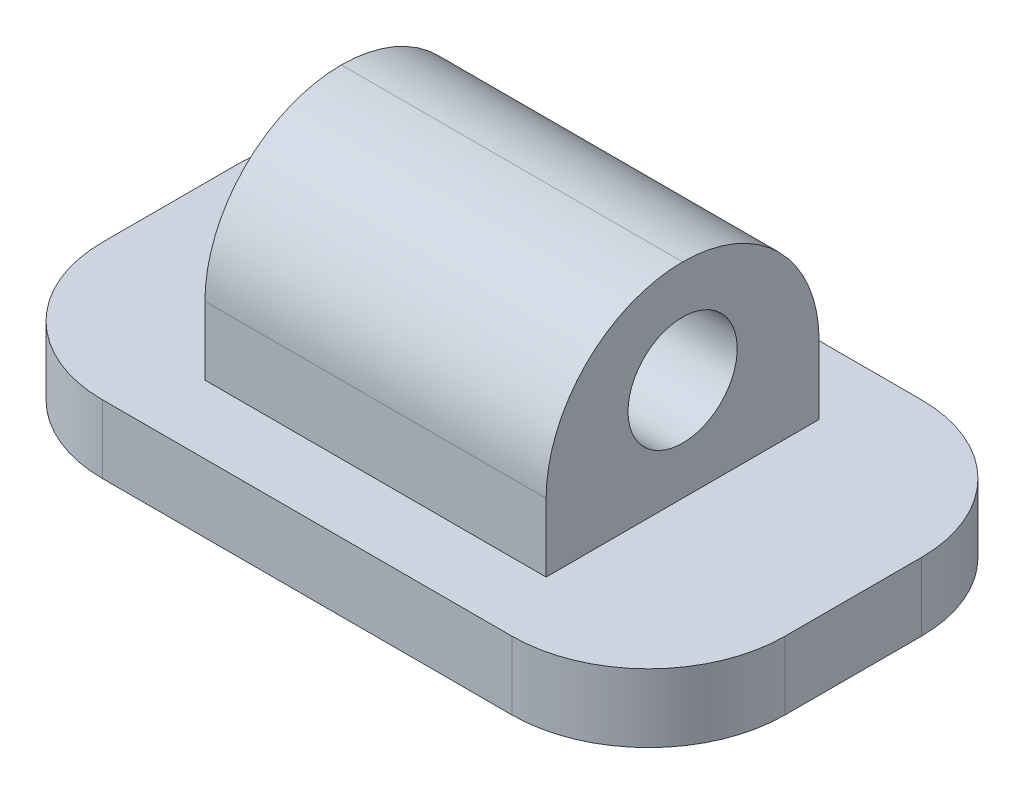
ISO-10303-21;
HEADER;
FILE_DESCRIPTION(('STEP AP214'),'2;1');
FILE_NAME('part.step','',(''),(''),'','','');
FILE_SCHEMA(('AUTOMOTIVE_DESIGN { 1 0 10303 214 1 1 1 1 }'));
ENDSEC;
DATA;
#1=APPLICATION_CONTEXT('core data for automotive mechanical design processes');
#2=APPLICATION_PROTOCOL_DEFINITION('international standard','automotive_design',2000,#1);
#3=PRODUCT_CONTEXT('',#1,'mechanical');
#4=PRODUCT('Part','Part','',(#3));
#5=PRODUCT_RELATED_PRODUCT_CATEGORY('part','',(#4));
#6=PRODUCT_DEFINITION_FORMATION('','',#4);
#7=PRODUCT_DEFINITION_CONTEXT('part definition',#1,'design');
#8=PRODUCT_DEFINITION('design','',#6,#7);
#9=PRODUCT_DEFINITION_SHAPE('','',#8);
#10=(LENGTH_UNIT() NAMED_UNIT(*) SI_UNIT(.MILLI.,.METRE.));
#11=(NAMED_UNIT(*) PLANE_ANGLE_UNIT() SI_UNIT($,.RADIAN.));
#12=(NAMED_UNIT(*) SI_UNIT($,.STERADIAN.) SOLID_ANGLE_UNIT());
#13=UNCERTAINTY_MEASURE_WITH_UNIT(LENGTH_MEASURE(1.E-05),#10,'distance_accuracy_value','');
#14=(GEOMETRIC_REPRESENTATION_CONTEXT(3) GLOBAL_UNCERTAINTY_ASSIGNED_CONTEXT((#13)) GLOBAL_UNIT_ASSIGNED_CONTEXT((#10,
#11,#12)) REPRESENTATION_CONTEXT('',''));
#15=CARTESIAN_POINT('',(0.,0.,0.));
#16=DIRECTION('',(0.,0.,1.));
#17=DIRECTION('',(1.,0.,0.));
#18=AXIS2_PLACEMENT_3D('',#15,#16,#17);
#19=CARTESIAN_POINT('',(0.,5.,0.));
#20=DIRECTION('',(0.,-1.,0.));
#21=DIRECTION('',(0.,0.,-1.));
#22=AXIS2_PLACEMENT_3D('',#19,#20,#21);
#23=PLANE('',#22);
#24=DIRECTION('',(0.,0.,-1.));
#25=VECTOR('',#24,1.);
#26=CARTESIAN_POINT('',(25.,5.,15.));
#27=LINE('',#26,#25);
#28=CARTESIAN_POINT('',(25.,5.,5.));
#29=VERTEX_POINT('',#28);
#30=CARTESIAN_POINT('',(25.,5.,-5.));
#31=VERTEX_POINT('',#30);
#32=EDGE_CURVE('E171',#29,#31,#27,.T.);
#33=ORIENTED_EDGE('',*,*,#32,.T.);
#34=CARTESIAN_POINT('',(15.,5.,-5.));
#35=DIRECTION('',(0.,-1.,0.));
#36=DIRECTION('',(0.,0.,-1.));
#37=AXIS2_PLACEMENT_3D('',#34,#35,#36);
#38=CIRCLE('',#37,10.);
#39=CARTESIAN_POINT('',(15.,5.,-15.));
#40=VERTEX_POINT('',#39);
#41=EDGE_CURVE('E237',#31,#40,#38,.F.);
#42=ORIENTED_EDGE('',*,*,#41,.T.);
#43=DIRECTION('',(-1.,0.,0.));
#44=VECTOR('',#43,1.);
#45=CARTESIAN_POINT('',(-25.,5.,-15.));
#46=LINE('',#45,#44);
#47=CARTESIAN_POINT('',(-15.,5.,-15.));
#48=VERTEX_POINT('',#47);
#49=EDGE_CURVE('E175',#40,#48,#46,.T.);
#50=ORIENTED_EDGE('',*,*,#49,.T.);
#51=CARTESIAN_POINT('',(-15.,5.,-5.));
#52=DIRECTION('',(0.,-1.,0.));
#53=DIRECTION('',(0.,0.,-1.));
#54=AXIS2_PLACEMENT_3D('',#51,#52,#53);
#55=CIRCLE('',#54,10.);
#56=CARTESIAN_POINT('',(-25.,5.,-5.));
#57=VERTEX_POINT('',#56);
#58=EDGE_CURVE('E228',#48,#57,#55,.F.);
#59=ORIENTED_EDGE('',*,*,#58,.T.);
#60=DIRECTION('',(0.,0.,1.));
#61=VECTOR('',#60,1.);
#62=CARTESIAN_POINT('',(-25.,5.,15.));
#63=LINE('',#62,#61);
#64=CARTESIAN_POINT('',(-25.,5.,5.));
#65=VERTEX_POINT('',#64);
#66=EDGE_CURVE('E180',#57,#65,#63,.T.);
#67=ORIENTED_EDGE('',*,*,#66,.T.);
#68=CARTESIAN_POINT('',(-15.,5.,5.));
#69=DIRECTION('',(0.,-1.,0.));
#70=DIRECTION('',(0.,0.,-1.));
#71=AXIS2_PLACEMENT_3D('',#68,#69,#70);
#72=CIRCLE('',#71,10.);
#73=CARTESIAN_POINT('',(-15.,5.,15.));
#74=VERTEX_POINT('',#73);
#75=EDGE_CURVE('E231',#65,#74,#72,.F.);
#76=ORIENTED_EDGE('',*,*,#75,.T.);
#77=DIRECTION('',(1.,0.,0.));
#78=VECTOR('',#77,1.);
#79=CARTESIAN_POINT('',(-25.,5.,15.));
#80=LINE('',#79,#78);
#81=CARTESIAN_POINT('',(15.,5.,15.));
#82=VERTEX_POINT('',#81);
#83=EDGE_CURVE('E184',#74,#82,#80,.T.);
#84=ORIENTED_EDGE('',*,*,#83,.T.);
#85=CARTESIAN_POINT('',(15.,5.,5.));
#86=DIRECTION('',(0.,-1.,0.));
#87=DIRECTION('',(0.,0.,-1.));
#88=AXIS2_PLACEMENT_3D('',#85,#86,#87);
#89=CIRCLE('',#88,10.);
#90=EDGE_CURVE('E234',#82,#29,#89,.F.);
#91=ORIENTED_EDGE('',*,*,#90,.T.);
#92=EDGE_LOOP('',(#33,#42,#50,#59,#67,#76,#84,#91));
#93=FACE_BOUND('',#92,.T.);
#94=DIRECTION('',(0.,0.,-1.));
#95=VECTOR('',#94,1.);
#96=CARTESIAN_POINT('',(12.5,5.,10.));
#97=LINE('',#96,#95);
#98=CARTESIAN_POINT('',(12.5,5.,10.));
#99=VERTEX_POINT('',#98);
#100=CARTESIAN_POINT('',(12.5,5.,-10.));
#101=VERTEX_POINT('',#100);
#102=EDGE_CURVE('E154',#99,#101,#97,.T.);
#103=ORIENTED_EDGE('',*,*,#102,.F.);
#104=DIRECTION('',(1.,0.,0.));
#105=VECTOR('',#104,1.);
#106=CARTESIAN_POINT('',(-12.5,5.,10.));
#107=LINE('',#106,#105);
#108=CARTESIAN_POINT('',(-12.5,5.,10.));
#109=VERTEX_POINT('',#108);
#110=EDGE_CURVE('E148',#109,#99,#107,.T.);
#111=ORIENTED_EDGE('',*,*,#110,.F.);
#112=DIRECTION('',(0.,0.,1.));
#113=VECTOR('',#112,1.);
#114=CARTESIAN_POINT('',(-12.5,5.,10.));
#115=LINE('',#114,#113);
#116=CARTESIAN_POINT('',(-12.5,5.,-10.));
#117=VERTEX_POINT('',#116);
#118=EDGE_CURVE('E133',#117,#109,#115,.T.);
#119=ORIENTED_EDGE('',*,*,#118,.F.);
#120=DIRECTION('',(-1.,0.,0.));
#121=VECTOR('',#120,1.);
#122=CARTESIAN_POINT('',(-12.5,5.,-10.));
#123=LINE('',#122,#121);
#124=EDGE_CURVE('E145',#101,#117,#123,.T.);
#125=ORIENTED_EDGE('',*,*,#124,.F.);
#126=EDGE_LOOP('',(#103,#111,#119,#125));
#127=FACE_BOUND('',#126,.T.);
#128=ADVANCED_FACE('F39',(#93,#127),#23,.F.);
#129=CARTESIAN_POINT('',(25.,5.,15.));
#130=DIRECTION('',(-1.,0.,0.));
#131=DIRECTION('',(0.,0.,1.));
#132=AXIS2_PLACEMENT_3D('',#129,#130,#131);
#133=PLANE('',#132);
#134=DIRECTION('',(0.,0.,-1.));
#135=VECTOR('',#134,1.);
#136=CARTESIAN_POINT('',(25.,0.,15.));
#137=LINE('',#136,#135);
#138=CARTESIAN_POINT('',(25.,0.,5.));
#139=VERTEX_POINT('',#138);
#140=CARTESIAN_POINT('',(25.,0.,-5.));
#141=VERTEX_POINT('',#140);
#142=EDGE_CURVE('E170',#139,#141,#137,.T.);
#143=ORIENTED_EDGE('',*,*,#142,.T.);
#144=DIRECTION('',(0.,-1.,0.));
#145=VECTOR('',#144,1.);
#146=CARTESIAN_POINT('',(25.,5.,-5.));
#147=LINE('',#146,#145);
#148=EDGE_CURVE('E225',#141,#31,#147,.F.);
#149=ORIENTED_EDGE('',*,*,#148,.T.);
#150=ORIENTED_EDGE('',*,*,#32,.F.);
#151=DIRECTION('',(0.,-1.,0.));
#152=VECTOR('',#151,1.);
#153=CARTESIAN_POINT('',(25.,5.,5.));
#154=LINE('',#153,#152);
#155=EDGE_CURVE('E221',#29,#139,#154,.T.);
#156=ORIENTED_EDGE('',*,*,#155,.T.);
#157=EDGE_LOOP('',(#143,#149,#150,#156));
#158=FACE_BOUND('',#157,.T.);
#159=ADVANCED_FACE('F301',(#158),#133,.F.);
#160=CARTESIAN_POINT('',(-25.,5.,-15.));
#161=DIRECTION('',(0.,0.,1.));
#162=DIRECTION('',(1.,0.,0.));
#163=AXIS2_PLACEMENT_3D('',#160,#161,#162);
#164=PLANE('',#163);
#165=ORIENTED_EDGE('',*,*,#49,.F.);
#166=DIRECTION('',(0.,-1.,0.));
#167=VECTOR('',#166,1.);
#168=CARTESIAN_POINT('',(15.,5.,-15.));
#169=LINE('',#168,#167);
#170=CARTESIAN_POINT('',(15.,0.,-15.));
#171=VERTEX_POINT('',#170);
#172=EDGE_CURVE('E205',#40,#171,#169,.T.);
#173=ORIENTED_EDGE('',*,*,#172,.T.);
#174=DIRECTION('',(-1.,0.,0.));
#175=VECTOR('',#174,1.);
#176=CARTESIAN_POINT('',(-25.,0.,-15.));
#177=LINE('',#176,#175);
#178=CARTESIAN_POINT('',(-15.,0.,-15.));
#179=VERTEX_POINT('',#178);
#180=EDGE_CURVE('E192',#171,#179,#177,.T.);
#181=ORIENTED_EDGE('',*,*,#180,.T.);
#182=DIRECTION('',(0.,-1.,0.));
#183=VECTOR('',#182,1.);
#184=CARTESIAN_POINT('',(-15.,5.,-15.));
#185=LINE('',#184,#183);
#186=EDGE_CURVE('E188',#179,#48,#185,.F.);
#187=ORIENTED_EDGE('',*,*,#186,.T.);
#188=EDGE_LOOP('',(#165,#173,#181,#187));
#189=FACE_BOUND('',#188,.T.);
#190=ADVANCED_FACE('F307',(#189),#164,.F.);
#191=CARTESIAN_POINT('',(-25.,5.,15.));
#192=DIRECTION('',(1.,0.,0.));
#193=DIRECTION('',(0.,0.,-1.));
#194=AXIS2_PLACEMENT_3D('',#191,#192,#193);
#195=PLANE('',#194);
#196=DIRECTION('',(0.,0.,1.));
#197=VECTOR('',#196,1.);
#198=CARTESIAN_POINT('',(-25.,0.,15.));
#199=LINE('',#198,#197);
#200=CARTESIAN_POINT('',(-25.,0.,-5.));
#201=VERTEX_POINT('',#200);
#202=CARTESIAN_POINT('',(-25.,0.,5.));
#203=VERTEX_POINT('',#202);
#204=EDGE_CURVE('E196',#201,#203,#199,.T.);
#205=ORIENTED_EDGE('',*,*,#204,.T.);
#206=DIRECTION('',(0.,-1.,0.));
#207=VECTOR('',#206,1.);
#208=CARTESIAN_POINT('',(-25.,5.,5.));
#209=LINE('',#208,#207);
#210=EDGE_CURVE('E251',#203,#65,#209,.F.);
#211=ORIENTED_EDGE('',*,*,#210,.T.);
#212=ORIENTED_EDGE('',*,*,#66,.F.);
#213=DIRECTION('',(0.,-1.,0.));
#214=VECTOR('',#213,1.);
#215=CARTESIAN_POINT('',(-25.,5.,-5.));
#216=LINE('',#215,#214);
#217=EDGE_CURVE('E247',#57,#201,#216,.T.);
#218=ORIENTED_EDGE('',*,*,#217,.T.);
#219=EDGE_LOOP('',(#205,#211,#212,#218));
#220=FACE_BOUND('',#219,.T.);
#221=ADVANCED_FACE('F321',(#220),#195,.F.);
#222=CARTESIAN_POINT('',(-25.,5.,15.));
#223=DIRECTION('',(0.,0.,-1.));
#224=DIRECTION('',(-1.,0.,0.));
#225=AXIS2_PLACEMENT_3D('',#222,#223,#224);
#226=PLANE('',#225);
#227=DIRECTION('',(1.,0.,0.));
#228=VECTOR('',#227,1.);
#229=CARTESIAN_POINT('',(-25.,0.,15.));
#230=LINE('',#229,#228);
#231=CARTESIAN_POINT('',(-15.,0.,15.));
#232=VERTEX_POINT('',#231);
#233=CARTESIAN_POINT('',(15.,0.,15.));
#234=VERTEX_POINT('',#233);
#235=EDGE_CURVE('E176',#232,#234,#230,.T.);
#236=ORIENTED_EDGE('',*,*,#235,.T.);
#237=DIRECTION('',(0.,-1.,0.));
#238=VECTOR('',#237,1.);
#239=CARTESIAN_POINT('',(15.,5.,15.));
#240=LINE('',#239,#238);
#241=EDGE_CURVE('E244',#234,#82,#240,.F.);
#242=ORIENTED_EDGE('',*,*,#241,.T.);
#243=ORIENTED_EDGE('',*,*,#83,.F.);
#244=DIRECTION('',(0.,-1.,0.));
#245=VECTOR('',#244,1.);
#246=CARTESIAN_POINT('',(-15.,5.,15.));
#247=LINE('',#246,#245);
#248=EDGE_CURVE('E240',#74,#232,#247,.T.);
#249=ORIENTED_EDGE('',*,*,#248,.T.);
#250=EDGE_LOOP('',(#236,#242,#243,#249));
#251=FACE_BOUND('',#250,.T.);
#252=ADVANCED_FACE('F317',(#251),#226,.F.);
#253=CARTESIAN_POINT('',(0.,0.,0.));
#254=DIRECTION('',(0.,-1.,0.));
#255=DIRECTION('',(0.,0.,-1.));
#256=AXIS2_PLACEMENT_3D('',#253,#254,#255);
#257=PLANE('',#256);
#258=ORIENTED_EDGE('',*,*,#180,.F.);
#259=CARTESIAN_POINT('',(15.,0.,-5.));
#260=DIRECTION('',(0.,-1.,0.));
#261=DIRECTION('',(0.,0.,-1.));
#262=AXIS2_PLACEMENT_3D('',#259,#260,#261);
#263=CIRCLE('',#262,10.);
#264=EDGE_CURVE('E218',#171,#141,#263,.T.);
#265=ORIENTED_EDGE('',*,*,#264,.T.);
#266=ORIENTED_EDGE('',*,*,#142,.F.);
#267=CARTESIAN_POINT('',(15.,0.,5.));
#268=DIRECTION('',(0.,-1.,0.));
#269=DIRECTION('',(0.,0.,-1.));
#270=AXIS2_PLACEMENT_3D('',#267,#268,#269);
#271=CIRCLE('',#270,10.);
#272=EDGE_CURVE('E215',#139,#234,#271,.T.);
#273=ORIENTED_EDGE('',*,*,#272,.T.);
#274=ORIENTED_EDGE('',*,*,#235,.F.);
#275=CARTESIAN_POINT('',(-15.,0.,5.));
#276=DIRECTION('',(0.,-1.,0.));
#277=DIRECTION('',(0.,0.,-1.));
#278=AXIS2_PLACEMENT_3D('',#275,#276,#277);
#279=CIRCLE('',#278,10.);
#280=EDGE_CURVE('E212',#232,#203,#279,.T.);
#281=ORIENTED_EDGE('',*,*,#280,.T.);
#282=ORIENTED_EDGE('',*,*,#204,.F.);
#283=CARTESIAN_POINT('',(-15.,0.,-5.));
#284=DIRECTION('',(0.,-1.,0.));
#285=DIRECTION('',(0.,0.,-1.));
#286=AXIS2_PLACEMENT_3D('',#283,#284,#285);
#287=CIRCLE('',#286,10.);
#288=EDGE_CURVE('E209',#201,#179,#287,.T.);
#289=ORIENTED_EDGE('',*,*,#288,.T.);
#290=EDGE_LOOP('',(#258,#265,#266,#273,#274,#281,#282,#289));
#291=FACE_BOUND('',#290,.T.);
#292=ADVANCED_FACE('F313',(#291),#257,.T.);
#293=CARTESIAN_POINT('',(15.,5.,-5.));
#294=DIRECTION('',(0.,-1.,0.));
#295=DIRECTION('',(0.,0.,-1.));
#296=AXIS2_PLACEMENT_3D('',#293,#294,#295);
#297=CYLINDRICAL_SURFACE('',#296,10.);
#298=ORIENTED_EDGE('',*,*,#41,.F.);
#299=ORIENTED_EDGE('',*,*,#148,.F.);
#300=ORIENTED_EDGE('',*,*,#264,.F.);
#301=ORIENTED_EDGE('',*,*,#172,.F.);
#302=EDGE_LOOP('',(#298,#299,#300,#301));
#303=FACE_BOUND('',#302,.T.);
#304=ADVANCED_FACE('F316',(#303),#297,.T.);
#305=CARTESIAN_POINT('',(15.,5.,5.));
#306=DIRECTION('',(0.,-1.,0.));
#307=DIRECTION('',(0.,0.,-1.));
#308=AXIS2_PLACEMENT_3D('',#305,#306,#307);
#309=CYLINDRICAL_SURFACE('',#308,10.);
#310=ORIENTED_EDGE('',*,*,#90,.F.);
#311=ORIENTED_EDGE('',*,*,#241,.F.);
#312=ORIENTED_EDGE('',*,*,#272,.F.);
#313=ORIENTED_EDGE('',*,*,#155,.F.);
#314=EDGE_LOOP('',(#310,#311,#312,#313));
#315=FACE_BOUND('',#314,.T.);
#316=ADVANCED_FACE('F331',(#315),#309,.T.);
#317=CARTESIAN_POINT('',(-15.,5.,5.));
#318=DIRECTION('',(0.,-1.,0.));
#319=DIRECTION('',(0.,0.,-1.));
#320=AXIS2_PLACEMENT_3D('',#317,#318,#319);
#321=CYLINDRICAL_SURFACE('',#320,10.);
#322=ORIENTED_EDGE('',*,*,#75,.F.);
#323=ORIENTED_EDGE('',*,*,#210,.F.);
#324=ORIENTED_EDGE('',*,*,#280,.F.);
#325=ORIENTED_EDGE('',*,*,#248,.F.);
#326=EDGE_LOOP('',(#322,#323,#324,#325));
#327=FACE_BOUND('',#326,.T.);
#328=ADVANCED_FACE('F335',(#327),#321,.T.);
#329=CARTESIAN_POINT('',(-15.,5.,-5.));
#330=DIRECTION('',(0.,-1.,0.));
#331=DIRECTION('',(0.,0.,-1.));
#332=AXIS2_PLACEMENT_3D('',#329,#330,#331);
#333=CYLINDRICAL_SURFACE('',#332,10.);
#334=ORIENTED_EDGE('',*,*,#58,.F.);
#335=ORIENTED_EDGE('',*,*,#186,.F.);
#336=ORIENTED_EDGE('',*,*,#288,.F.);
#337=ORIENTED_EDGE('',*,*,#217,.F.);
#338=EDGE_LOOP('',(#334,#335,#336,#337));
#339=FACE_BOUND('',#338,.T.);
#340=ADVANCED_FACE('F339',(#339),#333,.T.);
#341=CARTESIAN_POINT('',(12.5,20.,10.));
#342=DIRECTION('',(-1.,0.,0.));
#343=DIRECTION('',(0.,0.,1.));
#344=AXIS2_PLACEMENT_3D('',#341,#342,#343);
#345=PLANE('',#344);
#346=CARTESIAN_POINT('',(12.5,12.5,0.));
#347=DIRECTION('',(-1.,0.,0.));
#348=DIRECTION('',(0.,0.,1.));
#349=AXIS2_PLACEMENT_3D('',#346,#347,#348);
#350=CIRCLE('',#349,4.);
#351=CARTESIAN_POINT('',(12.5,12.5,4.));
#352=VERTEX_POINT('',#351);
#353=EDGE_CURVE('E157',#352,#352,#350,.T.);
#354=ORIENTED_EDGE('',*,*,#353,.T.);
#355=EDGE_LOOP('',(#354));
#356=FACE_BOUND('',#355,.T.);
#357=CARTESIAN_POINT('',(12.5,10.,0.));
#358=DIRECTION('',(-1.,0.,0.));
#359=DIRECTION('',(0.,0.,1.));
#360=AXIS2_PLACEMENT_3D('',#357,#358,#359);
#361=CIRCLE('',#360,10.);
#362=CARTESIAN_POINT('',(12.5,10.,-10.));
#363=VERTEX_POINT('',#362);
#364=CARTESIAN_POINT('',(12.5,20.,0.));
#365=VERTEX_POINT('',#364);
#366=EDGE_CURVE('E254',#363,#365,#361,.F.);
#367=ORIENTED_EDGE('',*,*,#366,.T.);
#368=CARTESIAN_POINT('',(12.5,10.,0.));
#369=DIRECTION('',(-1.,0.,0.));
#370=DIRECTION('',(0.,0.,1.));
#371=AXIS2_PLACEMENT_3D('',#368,#369,#370);
#372=CIRCLE('',#371,10.);
#373=CARTESIAN_POINT('',(12.5,10.,10.));
#374=VERTEX_POINT('',#373);
#375=EDGE_CURVE('E257',#365,#374,#372,.F.);
#376=ORIENTED_EDGE('',*,*,#375,.T.);
#377=DIRECTION('',(0.,-1.,0.));
#378=VECTOR('',#377,1.);
#379=CARTESIAN_POINT('',(12.5,20.,10.));
#380=LINE('',#379,#378);
#381=EDGE_CURVE('E163',#374,#99,#380,.T.);
#382=ORIENTED_EDGE('',*,*,#381,.T.);
#383=ORIENTED_EDGE('',*,*,#102,.T.);
#384=DIRECTION('',(0.,-1.,0.));
#385=VECTOR('',#384,1.);
#386=CARTESIAN_POINT('',(12.5,20.,-10.));
#387=LINE('',#386,#385);
#388=EDGE_CURVE('E138',#363,#101,#387,.T.);
#389=ORIENTED_EDGE('',*,*,#388,.F.);
#390=EDGE_LOOP('',(#367,#376,#382,#383,#389));
#391=FACE_BOUND('',#390,.T.);
#392=ADVANCED_FACE('F289',(#356,#391),#345,.F.);
#393=CARTESIAN_POINT('',(-12.5,20.,-10.));
#394=DIRECTION('',(0.,0.,1.));
#395=DIRECTION('',(1.,0.,0.));
#396=AXIS2_PLACEMENT_3D('',#393,#394,#395);
#397=PLANE('',#396);
#398=DIRECTION('',(0.,-1.,0.));
#399=VECTOR('',#398,1.);
#400=CARTESIAN_POINT('',(-12.5,20.,-10.));
#401=LINE('',#400,#399);
#402=CARTESIAN_POINT('',(-12.5,10.,-10.));
#403=VERTEX_POINT('',#402);
#404=EDGE_CURVE('E130',#403,#117,#401,.T.);
#405=ORIENTED_EDGE('',*,*,#404,.F.);
#406=DIRECTION('',(-1.,0.,0.));
#407=VECTOR('',#406,1.);
#408=CARTESIAN_POINT('',(-12.5,10.,-10.));
#409=LINE('',#408,#407);
#410=EDGE_CURVE('E11',#403,#363,#409,.F.);
#411=ORIENTED_EDGE('',*,*,#410,.T.);
#412=ORIENTED_EDGE('',*,*,#388,.T.);
#413=ORIENTED_EDGE('',*,*,#124,.T.);
#414=EDGE_LOOP('',(#405,#411,#412,#413));
#415=FACE_BOUND('',#414,.T.);
#416=ADVANCED_FACE('F151',(#415),#397,.F.);
#417=CARTESIAN_POINT('',(-12.5,20.,10.));
#418=DIRECTION('',(1.,0.,0.));
#419=DIRECTION('',(0.,0.,-1.));
#420=AXIS2_PLACEMENT_3D('',#417,#418,#419);
#421=PLANE('',#420);
#422=CARTESIAN_POINT('',(-12.5,12.5,0.));
#423=DIRECTION('',(-1.,0.,0.));
#424=DIRECTION('',(0.,0.,1.));
#425=AXIS2_PLACEMENT_3D('',#422,#423,#424);
#426=CIRCLE('',#425,4.);
#427=CARTESIAN_POINT('',(-12.5,12.5,4.));
#428=VERTEX_POINT('',#427);
#429=EDGE_CURVE('E279',#428,#428,#426,.T.);
#430=ORIENTED_EDGE('',*,*,#429,.F.);
#431=EDGE_LOOP('',(#430));
#432=FACE_BOUND('',#431,.T.);
#433=DIRECTION('',(0.,-1.,0.));
#434=VECTOR('',#433,1.);
#435=CARTESIAN_POINT('',(-12.5,20.,10.));
#436=LINE('',#435,#434);
#437=CARTESIAN_POINT('',(-12.5,10.,10.));
#438=VERTEX_POINT('',#437);
#439=EDGE_CURVE('E139',#438,#109,#436,.T.);
#440=ORIENTED_EDGE('',*,*,#439,.F.);
#441=CARTESIAN_POINT('',(-12.5,10.,0.));
#442=DIRECTION('',(1.,0.,0.));
#443=DIRECTION('',(0.,0.,-1.));
#444=AXIS2_PLACEMENT_3D('',#441,#442,#443);
#445=CIRCLE('',#444,10.);
#446=CARTESIAN_POINT('',(-12.5,20.,0.));
#447=VERTEX_POINT('',#446);
#448=EDGE_CURVE('E49',#438,#447,#445,.F.);
#449=ORIENTED_EDGE('',*,*,#448,.T.);
#450=CARTESIAN_POINT('',(-12.5,10.,0.));
#451=DIRECTION('',(1.,0.,0.));
#452=DIRECTION('',(0.,0.,-1.));
#453=AXIS2_PLACEMENT_3D('',#450,#451,#452);
#454=CIRCLE('',#453,10.);
#455=EDGE_CURVE('E56',#447,#403,#454,.F.);
#456=ORIENTED_EDGE('',*,*,#455,.T.);
#457=ORIENTED_EDGE('',*,*,#404,.T.);
#458=ORIENTED_EDGE('',*,*,#118,.T.);
#459=EDGE_LOOP('',(#440,#449,#456,#457,#458));
#460=FACE_BOUND('',#459,.T.);
#461=ADVANCED_FACE('F132',(#432,#460),#421,.F.);
#462=CARTESIAN_POINT('',(-12.5,20.,10.));
#463=DIRECTION('',(0.,0.,-1.));
#464=DIRECTION('',(-1.,0.,0.));
#465=AXIS2_PLACEMENT_3D('',#462,#463,#464);
#466=PLANE('',#465);
#467=ORIENTED_EDGE('',*,*,#381,.F.);
#468=DIRECTION('',(1.,0.,0.));
#469=VECTOR('',#468,1.);
#470=CARTESIAN_POINT('',(-12.5,10.,10.));
#471=LINE('',#470,#469);
#472=EDGE_CURVE('E260',#374,#438,#471,.F.);
#473=ORIENTED_EDGE('',*,*,#472,.T.);
#474=ORIENTED_EDGE('',*,*,#439,.T.);
#475=ORIENTED_EDGE('',*,*,#110,.T.);
#476=EDGE_LOOP('',(#467,#473,#474,#475));
#477=FACE_BOUND('',#476,.T.);
#478=ADVANCED_FACE('F270',(#477),#466,.F.);
#479=CARTESIAN_POINT('',(17.5,12.5,0.));
#480=DIRECTION('',(-1.,0.,0.));
#481=DIRECTION('',(0.,0.,1.));
#482=AXIS2_PLACEMENT_3D('',#479,#480,#481);
#483=CYLINDRICAL_SURFACE('',#482,4.);
#484=ORIENTED_EDGE('',*,*,#429,.T.);
#485=EDGE_LOOP('',(#484));
#486=FACE_BOUND('',#485,.T.);
#487=ORIENTED_EDGE('',*,*,#353,.F.);
#488=EDGE_LOOP('',(#487));
#489=FACE_BOUND('',#488,.T.);
#490=ADVANCED_FACE('F292',(#486,#489),#483,.F.);
#491=CARTESIAN_POINT('',(0.,10.,0.));
#492=DIRECTION('',(-1.,0.,0.));
#493=DIRECTION('',(0.,0.,1.));
#494=AXIS2_PLACEMENT_3D('',#491,#492,#493);
#495=CYLINDRICAL_SURFACE('',#494,10.);
#496=ORIENTED_EDGE('',*,*,#410,.F.);
#497=ORIENTED_EDGE('',*,*,#455,.F.);
#498=DIRECTION('',(-1.,0.,0.));
#499=VECTOR('',#498,1.);
#500=CARTESIAN_POINT('',(0.,20.,0.));
#501=LINE('',#500,#499);
#502=EDGE_CURVE('E43',#365,#447,#501,.T.);
#503=ORIENTED_EDGE('',*,*,#502,.F.);
#504=ORIENTED_EDGE('',*,*,#366,.F.);
#505=EDGE_LOOP('',(#496,#497,#503,#504));
#506=FACE_BOUND('',#505,.T.);
#507=ADVANCED_FACE('F41',(#506),#495,.T.);
#508=CARTESIAN_POINT('',(0.,10.,0.));
#509=DIRECTION('',(1.,0.,0.));
#510=DIRECTION('',(0.,0.,-1.));
#511=AXIS2_PLACEMENT_3D('',#508,#509,#510);
#512=CYLINDRICAL_SURFACE('',#511,10.);
#513=ORIENTED_EDGE('',*,*,#448,.F.);
#514=ORIENTED_EDGE('',*,*,#472,.F.);
#515=ORIENTED_EDGE('',*,*,#375,.F.);
#516=ORIENTED_EDGE('',*,*,#502,.T.);
#517=EDGE_LOOP('',(#513,#514,#515,#516));
#518=FACE_BOUND('',#517,.T.);
#519=ADVANCED_FACE('F273',(#518),#512,.T.);
#520=CLOSED_SHELL('',(#128,#159,#190,#221,#252,#292,#304,#316,#328,#340,#392,#416,#461,#478,
#490,#507,#519));
#521=MANIFOLD_SOLID_BREP('B2',#520);
#522=ADVANCED_BREP_SHAPE_REPRESENTATION('',(#18,#521),#14);
#523=SHAPE_DEFINITION_REPRESENTATION(#9,#522);
ENDSEC;
END-ISO-10303-21;
